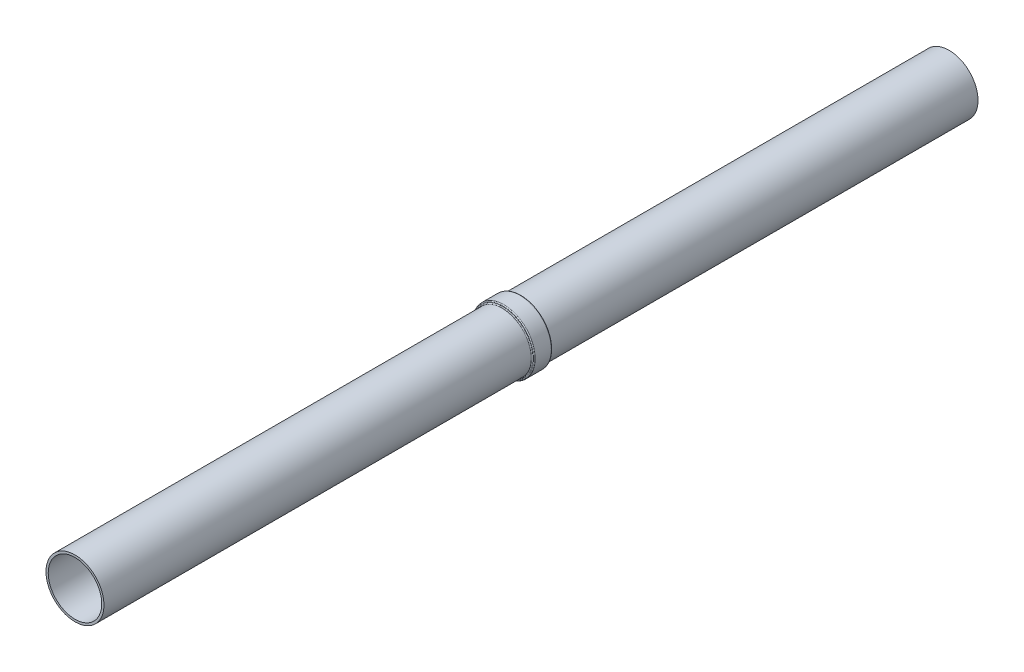
ISO-10303-21;
HEADER;
FILE_DESCRIPTION(('STEP AP214'),'2;1');
FILE_NAME('part.step','',(''),(''),'','','');
FILE_SCHEMA(('AUTOMOTIVE_DESIGN { 1 0 10303 214 1 1 1 1 }'));
ENDSEC;
DATA;
#1=APPLICATION_CONTEXT('core data for automotive mechanical design processes');
#2=APPLICATION_PROTOCOL_DEFINITION('international standard','automotive_design',2000,#1);
#3=PRODUCT_CONTEXT('',#1,'mechanical');
#4=PRODUCT('Part','Part','',(#3));
#5=PRODUCT_RELATED_PRODUCT_CATEGORY('part','',(#4));
#6=PRODUCT_DEFINITION_FORMATION('','',#4);
#7=PRODUCT_DEFINITION_CONTEXT('part definition',#1,'design');
#8=PRODUCT_DEFINITION('design','',#6,#7);
#9=PRODUCT_DEFINITION_SHAPE('','',#8);
#10=(LENGTH_UNIT() NAMED_UNIT(*) SI_UNIT(.MILLI.,.METRE.));
#11=(NAMED_UNIT(*) PLANE_ANGLE_UNIT() SI_UNIT($,.RADIAN.));
#12=(NAMED_UNIT(*) SI_UNIT($,.STERADIAN.) SOLID_ANGLE_UNIT());
#13=UNCERTAINTY_MEASURE_WITH_UNIT(LENGTH_MEASURE(1.E-05),#10,'distance_accuracy_value','');
#14=(GEOMETRIC_REPRESENTATION_CONTEXT(3) GLOBAL_UNCERTAINTY_ASSIGNED_CONTEXT((#13)) GLOBAL_UNIT_ASSIGNED_CONTEXT((#10,
#11,#12)) REPRESENTATION_CONTEXT('',''));
#15=CARTESIAN_POINT('',(0.,0.,0.));
#16=DIRECTION('',(0.,0.,1.));
#17=DIRECTION('',(1.,0.,0.));
#18=AXIS2_PLACEMENT_3D('',#15,#16,#17);
#19=CARTESIAN_POINT('',(0.,0.,0.));
#20=DIRECTION('',(0.,0.,1.));
#21=DIRECTION('',(1.,0.,0.));
#22=AXIS2_PLACEMENT_3D('',#19,#20,#21);
#23=PLANE('',#22);
#24=CARTESIAN_POINT('',(0.,0.,0.));
#25=DIRECTION('',(0.,0.,1.));
#26=DIRECTION('',(1.,0.,0.));
#27=AXIS2_PLACEMENT_3D('',#24,#25,#26);
#28=CIRCLE('',#27,41.275);
#29=CARTESIAN_POINT('',(-41.275,0.,0.));
#30=VERTEX_POINT('',#29);
#31=EDGE_CURVE('E73',#30,#30,#28,.T.);
#32=ORIENTED_EDGE('',*,*,#31,.F.);
#33=EDGE_LOOP('',(#32));
#34=FACE_BOUND('',#33,.T.);
#35=CARTESIAN_POINT('',(0.,0.,0.));
#36=DIRECTION('',(0.,0.,1.));
#37=DIRECTION('',(1.,0.,0.));
#38=AXIS2_PLACEMENT_3D('',#35,#36,#37);
#39=CIRCLE('',#38,38.1);
#40=CARTESIAN_POINT('',(-38.1,0.,0.));
#41=VERTEX_POINT('',#40);
#42=EDGE_CURVE('E76',#41,#41,#39,.T.);
#43=ORIENTED_EDGE('',*,*,#42,.T.);
#44=EDGE_LOOP('',(#43));
#45=FACE_BOUND('',#44,.T.);
#46=ADVANCED_FACE('F38',(#34,#45),#23,.F.);
#47=CARTESIAN_POINT('',(0.,0.,609.6));
#48=DIRECTION('',(0.,0.,-1.));
#49=DIRECTION('',(-1.,0.,0.));
#50=AXIS2_PLACEMENT_3D('',#47,#48,#49);
#51=CYLINDRICAL_SURFACE('',#50,41.275);
#52=CARTESIAN_POINT('',(0.,0.,608.33));
#53=DIRECTION('',(0.,0.,1.));
#54=DIRECTION('',(1.,0.,0.));
#55=AXIS2_PLACEMENT_3D('',#52,#53,#54);
#56=CIRCLE('',#55,41.275);
#57=CARTESIAN_POINT('',(-41.275,0.,608.33));
#58=VERTEX_POINT('',#57);
#59=EDGE_CURVE('E10',#58,#58,#56,.F.);
#60=CARTESIAN_POINT('',(-41.275,0.,608.33));
#61=CARTESIAN_POINT('',(-41.275,0.,601.993229166667));
#62=CARTESIAN_POINT('',(-41.275,0.,595.656458333333));
#63=CARTESIAN_POINT('',(-41.275,0.,582.982916666667));
#64=CARTESIAN_POINT('',(-41.275,0.,576.646145833333));
#65=CARTESIAN_POINT('',(-41.275,0.,563.972604166667));
#66=CARTESIAN_POINT('',(-41.275,0.,557.635833333333));
#67=CARTESIAN_POINT('',(-41.275,0.,544.962291666667));
#68=CARTESIAN_POINT('',(-41.275,0.,538.625520833333));
#69=CARTESIAN_POINT('',(-41.275,0.,525.951979166667));
#70=CARTESIAN_POINT('',(-41.275,0.,519.615208333333));
#71=CARTESIAN_POINT('',(-41.275,0.,506.941666666667));
#72=CARTESIAN_POINT('',(-41.275,0.,500.604895833333));
#73=CARTESIAN_POINT('',(-41.275,0.,487.931354166667));
#74=CARTESIAN_POINT('',(-41.275,0.,481.594583333333));
#75=CARTESIAN_POINT('',(-41.275,0.,468.921041666667));
#76=CARTESIAN_POINT('',(-41.275,0.,462.584270833333));
#77=CARTESIAN_POINT('',(-41.275,0.,449.910729166667));
#78=CARTESIAN_POINT('',(-41.275,0.,443.573958333333));
#79=CARTESIAN_POINT('',(-41.275,0.,430.900416666667));
#80=CARTESIAN_POINT('',(-41.275,0.,424.563645833333));
#81=CARTESIAN_POINT('',(-41.275,0.,411.890104166667));
#82=CARTESIAN_POINT('',(-41.275,0.,405.553333333333));
#83=CARTESIAN_POINT('',(-41.275,0.,392.879791666667));
#84=CARTESIAN_POINT('',(-41.275,0.,386.543020833333));
#85=CARTESIAN_POINT('',(-41.275,0.,373.869479166667));
#86=CARTESIAN_POINT('',(-41.275,0.,367.532708333333));
#87=CARTESIAN_POINT('',(-41.275,0.,354.859166666667));
#88=CARTESIAN_POINT('',(-41.275,0.,348.522395833333));
#89=CARTESIAN_POINT('',(-41.275,0.,335.848854166667));
#90=CARTESIAN_POINT('',(-41.275,0.,329.512083333333));
#91=CARTESIAN_POINT('',(-41.275,0.,316.838541666667));
#92=CARTESIAN_POINT('',(-41.275,0.,310.501770833333));
#93=CARTESIAN_POINT('',(-41.275,0.,297.828229166667));
#94=CARTESIAN_POINT('',(-41.275,0.,291.491458333333));
#95=CARTESIAN_POINT('',(-41.275,0.,278.817916666667));
#96=CARTESIAN_POINT('',(-41.275,0.,272.481145833333));
#97=CARTESIAN_POINT('',(-41.275,0.,259.807604166667));
#98=CARTESIAN_POINT('',(-41.275,0.,253.470833333333));
#99=CARTESIAN_POINT('',(-41.275,0.,240.797291666667));
#100=CARTESIAN_POINT('',(-41.275,0.,234.460520833333));
#101=CARTESIAN_POINT('',(-41.275,0.,221.786979166667));
#102=CARTESIAN_POINT('',(-41.275,0.,215.450208333333));
#103=CARTESIAN_POINT('',(-41.275,0.,202.776666666667));
#104=CARTESIAN_POINT('',(-41.275,0.,196.439895833333));
#105=CARTESIAN_POINT('',(-41.275,0.,183.766354166667));
#106=CARTESIAN_POINT('',(-41.275,0.,177.429583333333));
#107=CARTESIAN_POINT('',(-41.275,0.,164.756041666667));
#108=CARTESIAN_POINT('',(-41.275,0.,158.419270833333));
#109=CARTESIAN_POINT('',(-41.275,0.,145.745729166667));
#110=CARTESIAN_POINT('',(-41.275,0.,139.408958333333));
#111=CARTESIAN_POINT('',(-41.275,0.,126.735416666667));
#112=CARTESIAN_POINT('',(-41.275,0.,120.398645833333));
#113=CARTESIAN_POINT('',(-41.275,0.,107.725104166667));
#114=CARTESIAN_POINT('',(-41.275,0.,101.388333333333));
#115=CARTESIAN_POINT('',(-41.275,0.,88.7147916666667));
#116=CARTESIAN_POINT('',(-41.275,0.,82.3780208333334));
#117=CARTESIAN_POINT('',(-41.275,0.,69.7044791666667));
#118=CARTESIAN_POINT('',(-41.275,0.,63.3677083333333));
#119=CARTESIAN_POINT('',(-41.275,0.,50.6941666666667));
#120=CARTESIAN_POINT('',(-41.275,0.,44.3573958333334));
#121=CARTESIAN_POINT('',(-41.275,0.,31.6838541666667));
#122=CARTESIAN_POINT('',(-41.275,0.,25.3470833333333));
#123=CARTESIAN_POINT('',(-41.275,0.,12.6735416666666));
#124=CARTESIAN_POINT('',(-41.275,0.,6.33677083333332));
#125=CARTESIAN_POINT('',(-41.275,0.,0.));
#126=B_SPLINE_CURVE_WITH_KNOTS('',3,(#60,#61,#62,#63,#64,#65,#66,#67,#68,#69,#70,#71,#72,#73,
#74,#75,#76,#77,#78,#79,#80,#81,#82,#83,#84,#85,#86,#87,#88,#89,#90,#91,#92,#93,#94,#95,#96,#97,
#98,#99,#100,#101,#102,#103,#104,#105,#106,#107,#108,#109,#110,#111,#112,#113,#114,#115,#116,
#117,#118,#119,#120,#121,#122,#123,#124,#125),.UNSPECIFIED.,.F.,.F.,(4,2,2,2,2,2,2,2,2,2,2,2,2,
2,2,2,2,2,2,2,2,2,2,2,2,2,2,2,2,2,2,2,4),(0.,19.0103125,38.0206249999999,57.0309375,
76.0412499999999,95.0515624999999,114.061875,133.0721875,152.0825,171.0928125,190.103125,
209.1134375,228.12375,247.1340625,266.144375,285.1546875,304.165,323.1753125,342.185625,
361.1959375,380.20625,399.2165625,418.226875,437.2371875,456.2475,475.2578125,494.268125,
513.2784375,532.28875,551.2990625,570.309375,589.3196875,608.33),.UNSPECIFIED.);
#127=EDGE_CURVE('BSEAM109',#58,#30,#126,.T.);
#128=ORIENTED_EDGE('',*,*,#59,.T.);
#129=ORIENTED_EDGE('',*,*,#31,.T.);
#130=ORIENTED_EDGE('',*,*,#127,.T.);
#131=ORIENTED_EDGE('',*,*,#127,.F.);
#132=EDGE_LOOP('',(#128,#130,#129,#131));
#133=FACE_BOUND('',#132,.T.);
#134=ADVANCED_FACE('F109',(#133),#51,.T.);
#135=CARTESIAN_POINT('',(0.,0.,609.6));
#136=DIRECTION('',(0.,0.,-1.));
#137=DIRECTION('',(-1.,0.,0.));
#138=AXIS2_PLACEMENT_3D('',#135,#136,#137);
#139=CYLINDRICAL_SURFACE('',#138,38.1);
#140=CARTESIAN_POINT('',(0.,0.,609.6));
#141=DIRECTION('',(0.,0.,1.));
#142=DIRECTION('',(1.,0.,0.));
#143=AXIS2_PLACEMENT_3D('',#140,#141,#142);
#144=CIRCLE('',#143,38.1);
#145=CARTESIAN_POINT('',(-38.1,0.,609.6));
#146=VERTEX_POINT('',#145);
#147=EDGE_CURVE('E79',#146,#146,#144,.T.);
#148=CARTESIAN_POINT('',(-38.1,0.,609.6));
#149=CARTESIAN_POINT('',(-38.1,0.,603.25));
#150=CARTESIAN_POINT('',(-38.1,0.,596.9));
#151=CARTESIAN_POINT('',(-38.1,0.,584.2));
#152=CARTESIAN_POINT('',(-38.1,0.,577.85));
#153=CARTESIAN_POINT('',(-38.1,0.,565.15));
#154=CARTESIAN_POINT('',(-38.1,0.,558.8));
#155=CARTESIAN_POINT('',(-38.1,0.,546.1));
#156=CARTESIAN_POINT('',(-38.1,0.,539.75));
#157=CARTESIAN_POINT('',(-38.1,0.,527.05));
#158=CARTESIAN_POINT('',(-38.1,0.,520.7));
#159=CARTESIAN_POINT('',(-38.1,0.,508.));
#160=CARTESIAN_POINT('',(-38.1,0.,501.65));
#161=CARTESIAN_POINT('',(-38.1,0.,488.95));
#162=CARTESIAN_POINT('',(-38.1,0.,482.6));
#163=CARTESIAN_POINT('',(-38.1,0.,469.9));
#164=CARTESIAN_POINT('',(-38.1,0.,463.55));
#165=CARTESIAN_POINT('',(-38.1,0.,450.85));
#166=CARTESIAN_POINT('',(-38.1,0.,444.5));
#167=CARTESIAN_POINT('',(-38.1,0.,431.8));
#168=CARTESIAN_POINT('',(-38.1,0.,425.45));
#169=CARTESIAN_POINT('',(-38.1,0.,412.75));
#170=CARTESIAN_POINT('',(-38.1,0.,406.4));
#171=CARTESIAN_POINT('',(-38.1,0.,393.7));
#172=CARTESIAN_POINT('',(-38.1,0.,387.35));
#173=CARTESIAN_POINT('',(-38.1,0.,374.65));
#174=CARTESIAN_POINT('',(-38.1,0.,368.3));
#175=CARTESIAN_POINT('',(-38.1,0.,355.6));
#176=CARTESIAN_POINT('',(-38.1,0.,349.25));
#177=CARTESIAN_POINT('',(-38.1,0.,336.55));
#178=CARTESIAN_POINT('',(-38.1,0.,330.2));
#179=CARTESIAN_POINT('',(-38.1,0.,317.5));
#180=CARTESIAN_POINT('',(-38.1,0.,311.15));
#181=CARTESIAN_POINT('',(-38.1,0.,298.45));
#182=CARTESIAN_POINT('',(-38.1,0.,292.1));
#183=CARTESIAN_POINT('',(-38.1,0.,279.4));
#184=CARTESIAN_POINT('',(-38.1,0.,273.05));
#185=CARTESIAN_POINT('',(-38.1,0.,260.35));
#186=CARTESIAN_POINT('',(-38.1,0.,254.));
#187=CARTESIAN_POINT('',(-38.1,0.,241.3));
#188=CARTESIAN_POINT('',(-38.1,0.,234.95));
#189=CARTESIAN_POINT('',(-38.1,0.,222.25));
#190=CARTESIAN_POINT('',(-38.1,0.,215.9));
#191=CARTESIAN_POINT('',(-38.1,0.,203.2));
#192=CARTESIAN_POINT('',(-38.1,0.,196.85));
#193=CARTESIAN_POINT('',(-38.1,0.,184.15));
#194=CARTESIAN_POINT('',(-38.1,0.,177.8));
#195=CARTESIAN_POINT('',(-38.1,0.,165.1));
#196=CARTESIAN_POINT('',(-38.1,0.,158.75));
#197=CARTESIAN_POINT('',(-38.1,0.,146.05));
#198=CARTESIAN_POINT('',(-38.1,0.,139.7));
#199=CARTESIAN_POINT('',(-38.1,0.,127.));
#200=CARTESIAN_POINT('',(-38.1,0.,120.65));
#201=CARTESIAN_POINT('',(-38.1,0.,107.95));
#202=CARTESIAN_POINT('',(-38.1,0.,101.6));
#203=CARTESIAN_POINT('',(-38.1,0.,88.9));
#204=CARTESIAN_POINT('',(-38.1,0.,82.5500000000001));
#205=CARTESIAN_POINT('',(-38.1,0.,69.85));
#206=CARTESIAN_POINT('',(-38.1,0.,63.5));
#207=CARTESIAN_POINT('',(-38.1,0.,50.8));
#208=CARTESIAN_POINT('',(-38.1,0.,44.45));
#209=CARTESIAN_POINT('',(-38.1,0.,31.75));
#210=CARTESIAN_POINT('',(-38.1,0.,25.4));
#211=CARTESIAN_POINT('',(-38.1,0.,12.7));
#212=CARTESIAN_POINT('',(-38.1,0.,6.35000000000001));
#213=CARTESIAN_POINT('',(-38.1,0.,0.));
#214=B_SPLINE_CURVE_WITH_KNOTS('',3,(#148,#149,#150,#151,#152,#153,#154,#155,#156,#157,#158,
#159,#160,#161,#162,#163,#164,#165,#166,#167,#168,#169,#170,#171,#172,#173,#174,#175,#176,#177,
#178,#179,#180,#181,#182,#183,#184,#185,#186,#187,#188,#189,#190,#191,#192,#193,#194,#195,#196,
#197,#198,#199,#200,#201,#202,#203,#204,#205,#206,#207,#208,#209,#210,#211,#212,#213),
.UNSPECIFIED.,.F.,.F.,(4,2,2,2,2,2,2,2,2,2,2,2,2,2,2,2,2,2,2,2,2,2,2,2,2,2,2,2,2,2,2,2,4),(0.,
19.05,38.1,57.15,76.2,95.2500000000001,114.3,133.35,152.4,171.45,190.5,209.55,228.6,247.65,
266.7,285.75,304.8,323.85,342.9,361.95,381.,400.05,419.1,438.15,457.2,476.25,495.3,514.35,533.4,
552.45,571.5,590.55,609.6),.UNSPECIFIED.);
#215=EDGE_CURVE('BSEAM115',#146,#41,#214,.T.);
#216=ORIENTED_EDGE('',*,*,#147,.T.);
#217=ORIENTED_EDGE('',*,*,#42,.F.);
#218=ORIENTED_EDGE('',*,*,#215,.T.);
#219=ORIENTED_EDGE('',*,*,#215,.F.);
#220=EDGE_LOOP('',(#216,#218,#217,#219));
#221=FACE_BOUND('',#220,.T.);
#222=ADVANCED_FACE('F115',(#221),#139,.F.);
#223=CARTESIAN_POINT('',(0.,0.,609.6));
#224=DIRECTION('',(0.,0.,1.));
#225=DIRECTION('',(1.,0.,0.));
#226=AXIS2_PLACEMENT_3D('',#223,#224,#225);
#227=PLANE('',#226);
#228=ORIENTED_EDGE('',*,*,#147,.F.);
#229=EDGE_LOOP('',(#228));
#230=FACE_BOUND('',#229,.T.);
#231=ADVANCED_FACE('F106',(#230),#227,.F.);
#232=CARTESIAN_POINT('',(0.,0.,635.));
#233=DIRECTION('',(0.,0.,-1.));
#234=DIRECTION('',(-1.,0.,0.));
#235=AXIS2_PLACEMENT_3D('',#232,#233,#234);
#236=CYLINDRICAL_SURFACE('',#235,44.45);
#237=CARTESIAN_POINT('',(0.,0.,633.73));
#238=DIRECTION('',(0.,0.,1.));
#239=DIRECTION('',(1.,0.,0.));
#240=AXIS2_PLACEMENT_3D('',#237,#238,#239);
#241=CIRCLE('',#240,44.45);
#242=CARTESIAN_POINT('',(44.45,0.,633.73));
#243=VERTEX_POINT('',#242);
#244=EDGE_CURVE('E53',#243,#243,#241,.F.);
#245=ORIENTED_EDGE('',*,*,#244,.T.);
#246=EDGE_LOOP('',(#245));
#247=FACE_BOUND('',#246,.T.);
#248=CARTESIAN_POINT('',(0.,0.,610.87));
#249=DIRECTION('',(0.,0.,1.));
#250=DIRECTION('',(1.,0.,0.));
#251=AXIS2_PLACEMENT_3D('',#248,#249,#250);
#252=CIRCLE('',#251,44.45);
#253=CARTESIAN_POINT('',(44.45,0.,610.87));
#254=VERTEX_POINT('',#253);
#255=EDGE_CURVE('E58',#254,#254,#252,.T.);
#256=ORIENTED_EDGE('',*,*,#255,.T.);
#257=EDGE_LOOP('',(#256));
#258=FACE_BOUND('',#257,.T.);
#259=ADVANCED_FACE('F140',(#247,#258),#236,.T.);
#260=CARTESIAN_POINT('',(0.,0.,635.));
#261=DIRECTION('',(0.,0.,1.));
#262=DIRECTION('',(1.,0.,0.));
#263=AXIS2_PLACEMENT_3D('',#260,#261,#262);
#264=PLANE('',#263);
#265=CARTESIAN_POINT('',(0.,0.,635.));
#266=DIRECTION('',(0.,0.,1.));
#267=DIRECTION('',(1.,0.,0.));
#268=AXIS2_PLACEMENT_3D('',#265,#266,#267);
#269=CIRCLE('',#268,42.545);
#270=CARTESIAN_POINT('',(42.545,0.,635.));
#271=VERTEX_POINT('',#270);
#272=EDGE_CURVE('E61',#271,#271,#269,.F.);
#273=ORIENTED_EDGE('',*,*,#272,.T.);
#274=EDGE_LOOP('',(#273));
#275=FACE_BOUND('',#274,.T.);
#276=CARTESIAN_POINT('',(0.,0.,635.));
#277=DIRECTION('',(0.,0.,1.));
#278=DIRECTION('',(1.,0.,0.));
#279=AXIS2_PLACEMENT_3D('',#276,#277,#278);
#280=CIRCLE('',#279,43.18);
#281=CARTESIAN_POINT('',(43.18,0.,635.));
#282=VERTEX_POINT('',#281);
#283=EDGE_CURVE('E64',#282,#282,#280,.T.);
#284=ORIENTED_EDGE('',*,*,#283,.T.);
#285=EDGE_LOOP('',(#284));
#286=FACE_BOUND('',#285,.T.);
#287=ADVANCED_FACE('F104',(#275,#286),#264,.T.);
#288=CARTESIAN_POINT('',(0.,0.,609.6));
#289=DIRECTION('',(0.,0.,1.));
#290=DIRECTION('',(1.,0.,0.));
#291=AXIS2_PLACEMENT_3D('',#288,#289,#290);
#292=CIRCLE('',#291,43.18);
#293=CARTESIAN_POINT('',(43.18,0.,609.6));
#294=VERTEX_POINT('',#293);
#295=EDGE_CURVE('E45',#294,#294,#292,.F.);
#296=ORIENTED_EDGE('',*,*,#295,.T.);
#297=EDGE_LOOP('',(#296));
#298=FACE_BOUND('',#297,.T.);
#299=CARTESIAN_POINT('',(0.,0.,609.6));
#300=DIRECTION('',(0.,0.,1.));
#301=DIRECTION('',(1.,0.,0.));
#302=AXIS2_PLACEMENT_3D('',#299,#300,#301);
#303=CIRCLE('',#302,42.545);
#304=CARTESIAN_POINT('',(42.545,0.,609.6));
#305=VERTEX_POINT('',#304);
#306=EDGE_CURVE('E49',#305,#305,#303,.T.);
#307=ORIENTED_EDGE('',*,*,#306,.T.);
#308=EDGE_LOOP('',(#307));
#309=FACE_BOUND('',#308,.T.);
#310=ADVANCED_FACE('F95',(#298,#309),#227,.F.);
#311=CARTESIAN_POINT('',(0.,0.,1244.6));
#312=DIRECTION('',(0.,0.,1.));
#313=DIRECTION('',(1.,0.,0.));
#314=AXIS2_PLACEMENT_3D('',#311,#312,#313);
#315=PLANE('',#314);
#316=CARTESIAN_POINT('',(0.,0.,1244.6));
#317=DIRECTION('',(0.,0.,1.));
#318=DIRECTION('',(1.,0.,0.));
#319=AXIS2_PLACEMENT_3D('',#316,#317,#318);
#320=CIRCLE('',#319,41.275);
#321=CARTESIAN_POINT('',(-41.275,0.,1244.6));
#322=VERTEX_POINT('',#321);
#323=EDGE_CURVE('E82',#322,#322,#320,.T.);
#324=ORIENTED_EDGE('',*,*,#323,.T.);
#325=EDGE_LOOP('',(#324));
#326=FACE_BOUND('',#325,.T.);
#327=CARTESIAN_POINT('',(0.,0.,1244.6));
#328=DIRECTION('',(0.,0.,1.));
#329=DIRECTION('',(1.,0.,0.));
#330=AXIS2_PLACEMENT_3D('',#327,#328,#329);
#331=CIRCLE('',#330,38.1);
#332=CARTESIAN_POINT('',(-38.1,0.,1244.6));
#333=VERTEX_POINT('',#332);
#334=EDGE_CURVE('E85',#333,#333,#331,.T.);
#335=ORIENTED_EDGE('',*,*,#334,.F.);
#336=EDGE_LOOP('',(#335));
#337=FACE_BOUND('',#336,.T.);
#338=ADVANCED_FACE('F92',(#326,#337),#315,.T.);
#339=CARTESIAN_POINT('',(0.,0.,1244.6));
#340=DIRECTION('',(0.,0.,-1.));
#341=DIRECTION('',(-1.,0.,0.));
#342=AXIS2_PLACEMENT_3D('',#339,#340,#341);
#343=CYLINDRICAL_SURFACE('',#342,41.275);
#344=CARTESIAN_POINT('',(0.,0.,636.27));
#345=DIRECTION('',(0.,0.,1.));
#346=DIRECTION('',(1.,0.,0.));
#347=AXIS2_PLACEMENT_3D('',#344,#345,#346);
#348=CIRCLE('',#347,41.275);
#349=CARTESIAN_POINT('',(-41.275,0.,636.27));
#350=VERTEX_POINT('',#349);
#351=EDGE_CURVE('E67',#350,#350,#348,.T.);
#352=CARTESIAN_POINT('',(-41.275,0.,636.27));
#353=CARTESIAN_POINT('',(-41.275,0.,642.606770833333));
#354=CARTESIAN_POINT('',(-41.275,0.,648.943541666667));
#355=CARTESIAN_POINT('',(-41.275,0.,661.617083333333));
#356=CARTESIAN_POINT('',(-41.275,0.,667.953854166667));
#357=CARTESIAN_POINT('',(-41.275,0.,680.627395833333));
#358=CARTESIAN_POINT('',(-41.275,0.,686.964166666667));
#359=CARTESIAN_POINT('',(-41.275,0.,699.637708333333));
#360=CARTESIAN_POINT('',(-41.275,0.,705.974479166667));
#361=CARTESIAN_POINT('',(-41.275,0.,718.648020833333));
#362=CARTESIAN_POINT('',(-41.275,0.,724.984791666667));
#363=CARTESIAN_POINT('',(-41.275,0.,737.658333333333));
#364=CARTESIAN_POINT('',(-41.275,0.,743.995104166667));
#365=CARTESIAN_POINT('',(-41.275,0.,756.668645833333));
#366=CARTESIAN_POINT('',(-41.275,0.,763.005416666667));
#367=CARTESIAN_POINT('',(-41.275,0.,775.678958333333));
#368=CARTESIAN_POINT('',(-41.275,0.,782.015729166667));
#369=CARTESIAN_POINT('',(-41.275,0.,794.689270833333));
#370=CARTESIAN_POINT('',(-41.275,0.,801.026041666667));
#371=CARTESIAN_POINT('',(-41.275,0.,813.699583333333));
#372=CARTESIAN_POINT('',(-41.275,0.,820.036354166667));
#373=CARTESIAN_POINT('',(-41.275,0.,832.709895833333));
#374=CARTESIAN_POINT('',(-41.275,0.,839.046666666667));
#375=CARTESIAN_POINT('',(-41.275,0.,851.720208333333));
#376=CARTESIAN_POINT('',(-41.275,0.,858.056979166667));
#377=CARTESIAN_POINT('',(-41.275,0.,870.730520833333));
#378=CARTESIAN_POINT('',(-41.275,0.,877.067291666667));
#379=CARTESIAN_POINT('',(-41.275,0.,889.740833333333));
#380=CARTESIAN_POINT('',(-41.275,0.,896.077604166667));
#381=CARTESIAN_POINT('',(-41.275,0.,908.751145833333));
#382=CARTESIAN_POINT('',(-41.275,0.,915.087916666667));
#383=CARTESIAN_POINT('',(-41.275,0.,927.761458333333));
#384=CARTESIAN_POINT('',(-41.275,0.,934.098229166667));
#385=CARTESIAN_POINT('',(-41.275,0.,946.771770833333));
#386=CARTESIAN_POINT('',(-41.275,0.,953.108541666667));
#387=CARTESIAN_POINT('',(-41.275,0.,965.782083333333));
#388=CARTESIAN_POINT('',(-41.275,0.,972.118854166667));
#389=CARTESIAN_POINT('',(-41.275,0.,984.792395833333));
#390=CARTESIAN_POINT('',(-41.275,0.,991.129166666667));
#391=CARTESIAN_POINT('',(-41.275,0.,1003.80270833333));
#392=CARTESIAN_POINT('',(-41.275,0.,1010.13947916667));
#393=CARTESIAN_POINT('',(-41.275,0.,1022.81302083333));
#394=CARTESIAN_POINT('',(-41.275,0.,1029.14979166667));
#395=CARTESIAN_POINT('',(-41.275,0.,1041.82333333333));
#396=CARTESIAN_POINT('',(-41.275,0.,1048.16010416667));
#397=CARTESIAN_POINT('',(-41.275,0.,1060.83364583333));
#398=CARTESIAN_POINT('',(-41.275,0.,1067.17041666667));
#399=CARTESIAN_POINT('',(-41.275,0.,1079.84395833333));
#400=CARTESIAN_POINT('',(-41.275,0.,1086.18072916667));
#401=CARTESIAN_POINT('',(-41.275,0.,1098.85427083333));
#402=CARTESIAN_POINT('',(-41.275,0.,1105.19104166667));
#403=CARTESIAN_POINT('',(-41.275,0.,1117.86458333333));
#404=CARTESIAN_POINT('',(-41.275,0.,1124.20135416667));
#405=CARTESIAN_POINT('',(-41.275,0.,1136.87489583333));
#406=CARTESIAN_POINT('',(-41.275,0.,1143.21166666667));
#407=CARTESIAN_POINT('',(-41.275,0.,1155.88520833333));
#408=CARTESIAN_POINT('',(-41.275,0.,1162.22197916667));
#409=CARTESIAN_POINT('',(-41.275,0.,1174.89552083333));
#410=CARTESIAN_POINT('',(-41.275,0.,1181.23229166667));
#411=CARTESIAN_POINT('',(-41.275,0.,1193.90583333333));
#412=CARTESIAN_POINT('',(-41.275,0.,1200.24260416667));
#413=CARTESIAN_POINT('',(-41.275,0.,1212.91614583333));
#414=CARTESIAN_POINT('',(-41.275,0.,1219.25291666667));
#415=CARTESIAN_POINT('',(-41.275,0.,1231.92645833333));
#416=CARTESIAN_POINT('',(-41.275,0.,1238.26322916667));
#417=CARTESIAN_POINT('',(-41.275,0.,1244.6));
#418=B_SPLINE_CURVE_WITH_KNOTS('',3,(#352,#353,#354,#355,#356,#357,#358,#359,#360,#361,#362,
#363,#364,#365,#366,#367,#368,#369,#370,#371,#372,#373,#374,#375,#376,#377,#378,#379,#380,#381,
#382,#383,#384,#385,#386,#387,#388,#389,#390,#391,#392,#393,#394,#395,#396,#397,#398,#399,#400,
#401,#402,#403,#404,#405,#406,#407,#408,#409,#410,#411,#412,#413,#414,#415,#416,#417),
.UNSPECIFIED.,.F.,.F.,(4,2,2,2,2,2,2,2,2,2,2,2,2,2,2,2,2,2,2,2,2,2,2,2,2,2,2,2,2,2,2,2,4),(0.,
19.0103125,38.020625,57.0309375,76.0412500000001,95.0515625,114.061875,133.0721875,152.0825,
171.0928125,190.103125,209.1134375,228.12375,247.1340625,266.144375,285.1546875,304.165,
323.1753125,342.185625,361.1959375,380.20625,399.2165625,418.226875,437.2371875,456.2475,
475.2578125,494.268125,513.2784375,532.28875,551.2990625,570.309375,589.3196875,608.33),.UNSPECIFIED.);
#419=EDGE_CURVE('BSEAM94',#350,#322,#418,.T.);
#420=ORIENTED_EDGE('',*,*,#351,.T.);
#421=ORIENTED_EDGE('',*,*,#323,.F.);
#422=ORIENTED_EDGE('',*,*,#419,.T.);
#423=ORIENTED_EDGE('',*,*,#419,.F.);
#424=EDGE_LOOP('',(#420,#422,#421,#423));
#425=FACE_BOUND('',#424,.T.);
#426=ADVANCED_FACE('F94',(#425),#343,.T.);
#427=CARTESIAN_POINT('',(0.,0.,1244.6));
#428=DIRECTION('',(0.,0.,-1.));
#429=DIRECTION('',(-1.,0.,0.));
#430=AXIS2_PLACEMENT_3D('',#427,#428,#429);
#431=CYLINDRICAL_SURFACE('',#430,38.1);
#432=CARTESIAN_POINT('',(0.,0.,635.));
#433=DIRECTION('',(0.,0.,1.));
#434=DIRECTION('',(1.,0.,0.));
#435=AXIS2_PLACEMENT_3D('',#432,#433,#434);
#436=CIRCLE('',#435,38.1);
#437=CARTESIAN_POINT('',(-38.1,0.,635.));
#438=VERTEX_POINT('',#437);
#439=EDGE_CURVE('E70',#438,#438,#436,.F.);
#440=CARTESIAN_POINT('',(-38.1,0.,1244.6));
#441=CARTESIAN_POINT('',(-38.1,0.,1238.25));
#442=CARTESIAN_POINT('',(-38.1,0.,1231.9));
#443=CARTESIAN_POINT('',(-38.1,0.,1219.2));
#444=CARTESIAN_POINT('',(-38.1,0.,1212.85));
#445=CARTESIAN_POINT('',(-38.1,0.,1200.15));
#446=CARTESIAN_POINT('',(-38.1,0.,1193.8));
#447=CARTESIAN_POINT('',(-38.1,0.,1181.1));
#448=CARTESIAN_POINT('',(-38.1,0.,1174.75));
#449=CARTESIAN_POINT('',(-38.1,0.,1162.05));
#450=CARTESIAN_POINT('',(-38.1,0.,1155.7));
#451=CARTESIAN_POINT('',(-38.1,0.,1143.));
#452=CARTESIAN_POINT('',(-38.1,0.,1136.65));
#453=CARTESIAN_POINT('',(-38.1,0.,1123.95));
#454=CARTESIAN_POINT('',(-38.1,0.,1117.6));
#455=CARTESIAN_POINT('',(-38.1,0.,1104.9));
#456=CARTESIAN_POINT('',(-38.1,0.,1098.55));
#457=CARTESIAN_POINT('',(-38.1,0.,1085.85));
#458=CARTESIAN_POINT('',(-38.1,0.,1079.5));
#459=CARTESIAN_POINT('',(-38.1,0.,1066.8));
#460=CARTESIAN_POINT('',(-38.1,0.,1060.45));
#461=CARTESIAN_POINT('',(-38.1,0.,1047.75));
#462=CARTESIAN_POINT('',(-38.1,0.,1041.4));
#463=CARTESIAN_POINT('',(-38.1,0.,1028.7));
#464=CARTESIAN_POINT('',(-38.1,0.,1022.35));
#465=CARTESIAN_POINT('',(-38.1,0.,1009.65));
#466=CARTESIAN_POINT('',(-38.1,0.,1003.3));
#467=CARTESIAN_POINT('',(-38.1,0.,990.6));
#468=CARTESIAN_POINT('',(-38.1,0.,984.25));
#469=CARTESIAN_POINT('',(-38.1,0.,971.55));
#470=CARTESIAN_POINT('',(-38.1,0.,965.2));
#471=CARTESIAN_POINT('',(-38.1,0.,952.5));
#472=CARTESIAN_POINT('',(-38.1,0.,946.15));
#473=CARTESIAN_POINT('',(-38.1,0.,933.45));
#474=CARTESIAN_POINT('',(-38.1,0.,927.1));
#475=CARTESIAN_POINT('',(-38.1,0.,914.4));
#476=CARTESIAN_POINT('',(-38.1,0.,908.05));
#477=CARTESIAN_POINT('',(-38.1,0.,895.35));
#478=CARTESIAN_POINT('',(-38.1,0.,889.));
#479=CARTESIAN_POINT('',(-38.1,0.,876.3));
#480=CARTESIAN_POINT('',(-38.1,0.,869.95));
#481=CARTESIAN_POINT('',(-38.1,0.,857.25));
#482=CARTESIAN_POINT('',(-38.1,0.,850.9));
#483=CARTESIAN_POINT('',(-38.1,0.,838.2));
#484=CARTESIAN_POINT('',(-38.1,0.,831.85));
#485=CARTESIAN_POINT('',(-38.1,0.,819.15));
#486=CARTESIAN_POINT('',(-38.1,0.,812.8));
#487=CARTESIAN_POINT('',(-38.1,0.,800.1));
#488=CARTESIAN_POINT('',(-38.1,0.,793.75));
#489=CARTESIAN_POINT('',(-38.1,0.,781.05));
#490=CARTESIAN_POINT('',(-38.1,0.,774.7));
#491=CARTESIAN_POINT('',(-38.1,0.,762.));
#492=CARTESIAN_POINT('',(-38.1,0.,755.65));
#493=CARTESIAN_POINT('',(-38.1,0.,742.95));
#494=CARTESIAN_POINT('',(-38.1,0.,736.6));
#495=CARTESIAN_POINT('',(-38.1,0.,723.9));
#496=CARTESIAN_POINT('',(-38.1,0.,717.55));
#497=CARTESIAN_POINT('',(-38.1,0.,704.85));
#498=CARTESIAN_POINT('',(-38.1,0.,698.5));
#499=CARTESIAN_POINT('',(-38.1,0.,685.8));
#500=CARTESIAN_POINT('',(-38.1,0.,679.45));
#501=CARTESIAN_POINT('',(-38.1,0.,666.75));
#502=CARTESIAN_POINT('',(-38.1,0.,660.4));
#503=CARTESIAN_POINT('',(-38.1,0.,647.7));
#504=CARTESIAN_POINT('',(-38.1,0.,641.35));
#505=CARTESIAN_POINT('',(-38.1,0.,635.));
#506=B_SPLINE_CURVE_WITH_KNOTS('',3,(#440,#441,#442,#443,#444,#445,#446,#447,#448,#449,#450,
#451,#452,#453,#454,#455,#456,#457,#458,#459,#460,#461,#462,#463,#464,#465,#466,#467,#468,#469,
#470,#471,#472,#473,#474,#475,#476,#477,#478,#479,#480,#481,#482,#483,#484,#485,#486,#487,#488,
#489,#490,#491,#492,#493,#494,#495,#496,#497,#498,#499,#500,#501,#502,#503,#504,#505),
.UNSPECIFIED.,.F.,.F.,(4,2,2,2,2,2,2,2,2,2,2,2,2,2,2,2,2,2,2,2,2,2,2,2,2,2,2,2,2,2,2,2,4),(0.,
19.05,38.1,57.15,76.2,95.2500000000001,114.3,133.35,152.4,171.45,190.5,209.55,228.6,247.65,
266.7,285.75,304.8,323.85,342.9,361.95,381.,400.05,419.1,438.15,457.2,476.25,495.3,514.35,533.4,
552.45,571.5,590.55,609.6),.UNSPECIFIED.);
#507=EDGE_CURVE('BSEAM89',#333,#438,#506,.T.);
#508=ORIENTED_EDGE('',*,*,#334,.T.);
#509=ORIENTED_EDGE('',*,*,#439,.T.);
#510=ORIENTED_EDGE('',*,*,#507,.T.);
#511=ORIENTED_EDGE('',*,*,#507,.F.);
#512=EDGE_LOOP('',(#508,#510,#509,#511));
#513=FACE_BOUND('',#512,.T.);
#514=ADVANCED_FACE('F89',(#513),#431,.F.);
#515=ORIENTED_EDGE('',*,*,#439,.F.);
#516=EDGE_LOOP('',(#515));
#517=FACE_BOUND('',#516,.T.);
#518=ADVANCED_FACE('F126',(#517),#264,.T.);
#519=CARTESIAN_POINT('',(0.,0.,636.27));
#520=DIRECTION('',(0.,0.,1.));
#521=DIRECTION('',(1.,0.,0.));
#522=AXIS2_PLACEMENT_3D('',#519,#520,#521);
#523=TOROIDAL_SURFACE('',#522,42.545,1.27);
#524=ORIENTED_EDGE('',*,*,#272,.F.);
#525=EDGE_LOOP('',(#524));
#526=FACE_BOUND('',#525,.T.);
#527=ORIENTED_EDGE('',*,*,#351,.F.);
#528=EDGE_LOOP('',(#527));
#529=FACE_BOUND('',#528,.T.);
#530=ADVANCED_FACE('F122',(#526,#529),#523,.F.);
#531=CARTESIAN_POINT('',(0.,0.,633.73));
#532=DIRECTION('',(0.,0.,1.));
#533=DIRECTION('',(1.,0.,0.));
#534=AXIS2_PLACEMENT_3D('',#531,#532,#533);
#535=TOROIDAL_SURFACE('',#534,43.18,1.27);
#536=ORIENTED_EDGE('',*,*,#244,.F.);
#537=EDGE_LOOP('',(#536));
#538=FACE_BOUND('',#537,.T.);
#539=ORIENTED_EDGE('',*,*,#283,.F.);
#540=EDGE_LOOP('',(#539));
#541=FACE_BOUND('',#540,.T.);
#542=ADVANCED_FACE('F125',(#538,#541),#535,.T.);
#543=CARTESIAN_POINT('',(0.,0.,610.87));
#544=DIRECTION('',(0.,0.,1.));
#545=DIRECTION('',(1.,0.,0.));
#546=AXIS2_PLACEMENT_3D('',#543,#544,#545);
#547=TOROIDAL_SURFACE('',#546,43.18,1.27);
#548=ORIENTED_EDGE('',*,*,#295,.F.);
#549=EDGE_LOOP('',(#548));
#550=FACE_BOUND('',#549,.T.);
#551=ORIENTED_EDGE('',*,*,#255,.F.);
#552=EDGE_LOOP('',(#551));
#553=FACE_BOUND('',#552,.T.);
#554=ADVANCED_FACE('F129',(#550,#553),#547,.T.);
#555=CARTESIAN_POINT('',(0.,0.,608.33));
#556=DIRECTION('',(0.,0.,1.));
#557=DIRECTION('',(1.,0.,0.));
#558=AXIS2_PLACEMENT_3D('',#555,#556,#557);
#559=TOROIDAL_SURFACE('',#558,42.545,1.27);
#560=ORIENTED_EDGE('',*,*,#59,.F.);
#561=EDGE_LOOP('',(#560));
#562=FACE_BOUND('',#561,.T.);
#563=ORIENTED_EDGE('',*,*,#306,.F.);
#564=EDGE_LOOP('',(#563));
#565=FACE_BOUND('',#564,.T.);
#566=ADVANCED_FACE('F40',(#562,#565),#559,.F.);
#567=CLOSED_SHELL('',(#46,#134,#222,#231,#259,#287,#310,#338,#426,#514,#518,#530,#542,#554,#566));
#568=MANIFOLD_SOLID_BREP('B2',#567);
#569=ADVANCED_BREP_SHAPE_REPRESENTATION('',(#18,#568),#14);
#570=SHAPE_DEFINITION_REPRESENTATION(#9,#569);
ENDSEC;
END-ISO-10303-21;
